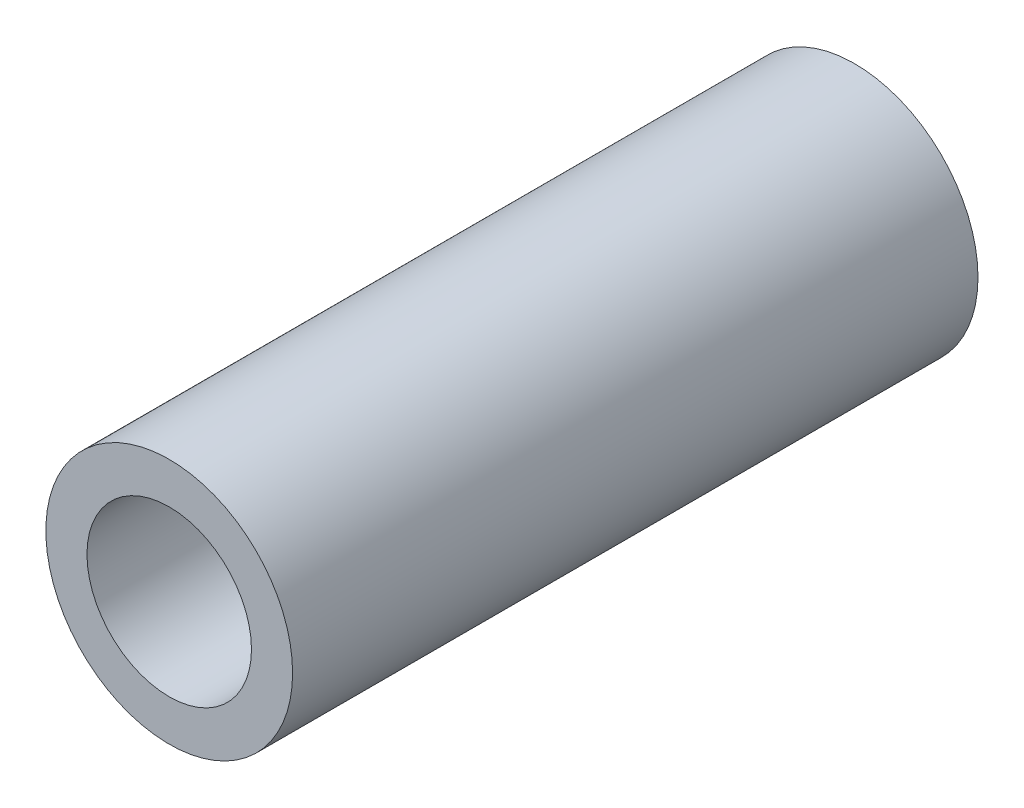
ISO-10303-21;
HEADER;
FILE_DESCRIPTION(('STEP AP214'),'2;1');
FILE_NAME('part.step','',(''),(''),'','','');
FILE_SCHEMA(('AUTOMOTIVE_DESIGN { 1 0 10303 214 1 1 1 1 }'));
ENDSEC;
DATA;
#1=APPLICATION_CONTEXT('core data for automotive mechanical design processes');
#2=APPLICATION_PROTOCOL_DEFINITION('international standard','automotive_design',2000,#1);
#3=PRODUCT_CONTEXT('',#1,'mechanical');
#4=PRODUCT('Part','Part','',(#3));
#5=PRODUCT_RELATED_PRODUCT_CATEGORY('part','',(#4));
#6=PRODUCT_DEFINITION_FORMATION('','',#4);
#7=PRODUCT_DEFINITION_CONTEXT('part definition',#1,'design');
#8=PRODUCT_DEFINITION('design','',#6,#7);
#9=PRODUCT_DEFINITION_SHAPE('','',#8);
#10=(LENGTH_UNIT() NAMED_UNIT(*) SI_UNIT(.MILLI.,.METRE.));
#11=(NAMED_UNIT(*) PLANE_ANGLE_UNIT() SI_UNIT($,.RADIAN.));
#12=(NAMED_UNIT(*) SI_UNIT($,.STERADIAN.) SOLID_ANGLE_UNIT());
#13=UNCERTAINTY_MEASURE_WITH_UNIT(LENGTH_MEASURE(1.E-05),#10,'distance_accuracy_value','');
#14=(GEOMETRIC_REPRESENTATION_CONTEXT(3) GLOBAL_UNCERTAINTY_ASSIGNED_CONTEXT((#13)) GLOBAL_UNIT_ASSIGNED_CONTEXT((#10,
#11,#12)) REPRESENTATION_CONTEXT('',''));
#15=CARTESIAN_POINT('',(0.,0.,0.));
#16=DIRECTION('',(0.,0.,1.));
#17=DIRECTION('',(1.,0.,0.));
#18=AXIS2_PLACEMENT_3D('',#15,#16,#17);
#19=CARTESIAN_POINT('',(0.,0.,50.));
#20=DIRECTION('',(0.,0.,-1.));
#21=DIRECTION('',(-1.,0.,0.));
#22=AXIS2_PLACEMENT_3D('',#19,#20,#21);
#23=CYLINDRICAL_SURFACE('',#22,9.);
#24=CARTESIAN_POINT('',(0.,0.,50.));
#25=DIRECTION('',(0.,0.,1.));
#26=DIRECTION('',(1.,0.,0.));
#27=AXIS2_PLACEMENT_3D('',#24,#25,#26);
#28=CIRCLE('',#27,9.);
#29=CARTESIAN_POINT('',(9.,0.,50.));
#30=VERTEX_POINT('',#29);
#31=EDGE_CURVE('E10',#30,#30,#28,.T.);
#32=ORIENTED_EDGE('',*,*,#31,.F.);
#33=EDGE_LOOP('',(#32));
#34=FACE_BOUND('',#33,.T.);
#35=CARTESIAN_POINT('',(0.,0.,0.));
#36=DIRECTION('',(0.,0.,1.));
#37=DIRECTION('',(1.,0.,0.));
#38=AXIS2_PLACEMENT_3D('',#35,#36,#37);
#39=CIRCLE('',#38,9.);
#40=CARTESIAN_POINT('',(9.,0.,0.));
#41=VERTEX_POINT('',#40);
#42=EDGE_CURVE('E40',#41,#41,#39,.T.);
#43=ORIENTED_EDGE('',*,*,#42,.T.);
#44=EDGE_LOOP('',(#43));
#45=FACE_BOUND('',#44,.T.);
#46=ADVANCED_FACE('F37',(#34,#45),#23,.T.);
#47=CARTESIAN_POINT('',(0.,0.,50.));
#48=DIRECTION('',(0.,0.,1.));
#49=DIRECTION('',(1.,0.,0.));
#50=AXIS2_PLACEMENT_3D('',#47,#48,#49);
#51=PLANE('',#50);
#52=CARTESIAN_POINT('',(0.,0.,50.));
#53=DIRECTION('',(0.,0.,1.));
#54=DIRECTION('',(1.,0.,0.));
#55=AXIS2_PLACEMENT_3D('',#52,#53,#54);
#56=CIRCLE('',#55,6.);
#57=CARTESIAN_POINT('',(6.,0.,50.));
#58=VERTEX_POINT('',#57);
#59=EDGE_CURVE('E49',#58,#58,#56,.T.);
#60=ORIENTED_EDGE('',*,*,#59,.F.);
#61=EDGE_LOOP('',(#60));
#62=FACE_BOUND('',#61,.T.);
#63=ORIENTED_EDGE('',*,*,#31,.T.);
#64=EDGE_LOOP('',(#63));
#65=FACE_BOUND('',#64,.T.);
#66=ADVANCED_FACE('F64',(#62,#65),#51,.T.);
#67=CARTESIAN_POINT('',(0.,0.,0.));
#68=DIRECTION('',(0.,0.,1.));
#69=DIRECTION('',(1.,0.,0.));
#70=AXIS2_PLACEMENT_3D('',#67,#68,#69);
#71=PLANE('',#70);
#72=CARTESIAN_POINT('',(0.,0.,0.));
#73=DIRECTION('',(0.,0.,1.));
#74=DIRECTION('',(1.,0.,0.));
#75=AXIS2_PLACEMENT_3D('',#72,#73,#74);
#76=CIRCLE('',#75,6.);
#77=CARTESIAN_POINT('',(6.,0.,0.));
#78=VERTEX_POINT('',#77);
#79=EDGE_CURVE('E47',#78,#78,#76,.T.);
#80=ORIENTED_EDGE('',*,*,#79,.T.);
#81=EDGE_LOOP('',(#80));
#82=FACE_BOUND('',#81,.T.);
#83=ORIENTED_EDGE('',*,*,#42,.F.);
#84=EDGE_LOOP('',(#83));
#85=FACE_BOUND('',#84,.T.);
#86=ADVANCED_FACE('F55',(#82,#85),#71,.F.);
#87=CARTESIAN_POINT('',(0.,0.,0.));
#88=DIRECTION('',(0.,0.,1.));
#89=DIRECTION('',(1.,0.,0.));
#90=AXIS2_PLACEMENT_3D('',#87,#88,#89);
#91=CYLINDRICAL_SURFACE('',#90,6.);
#92=ORIENTED_EDGE('',*,*,#79,.F.);
#93=EDGE_LOOP('',(#92));
#94=FACE_BOUND('',#93,.T.);
#95=ORIENTED_EDGE('',*,*,#59,.T.);
#96=EDGE_LOOP('',(#95));
#97=FACE_BOUND('',#96,.T.);
#98=ADVANCED_FACE('F58',(#94,#97),#91,.F.);
#99=CLOSED_SHELL('',(#46,#66,#86,#98));
#100=MANIFOLD_SOLID_BREP('B2',#99);
#101=ADVANCED_BREP_SHAPE_REPRESENTATION('',(#18,#100),#14);
#102=SHAPE_DEFINITION_REPRESENTATION(#9,#101);
ENDSEC;
END-ISO-10303-21;
